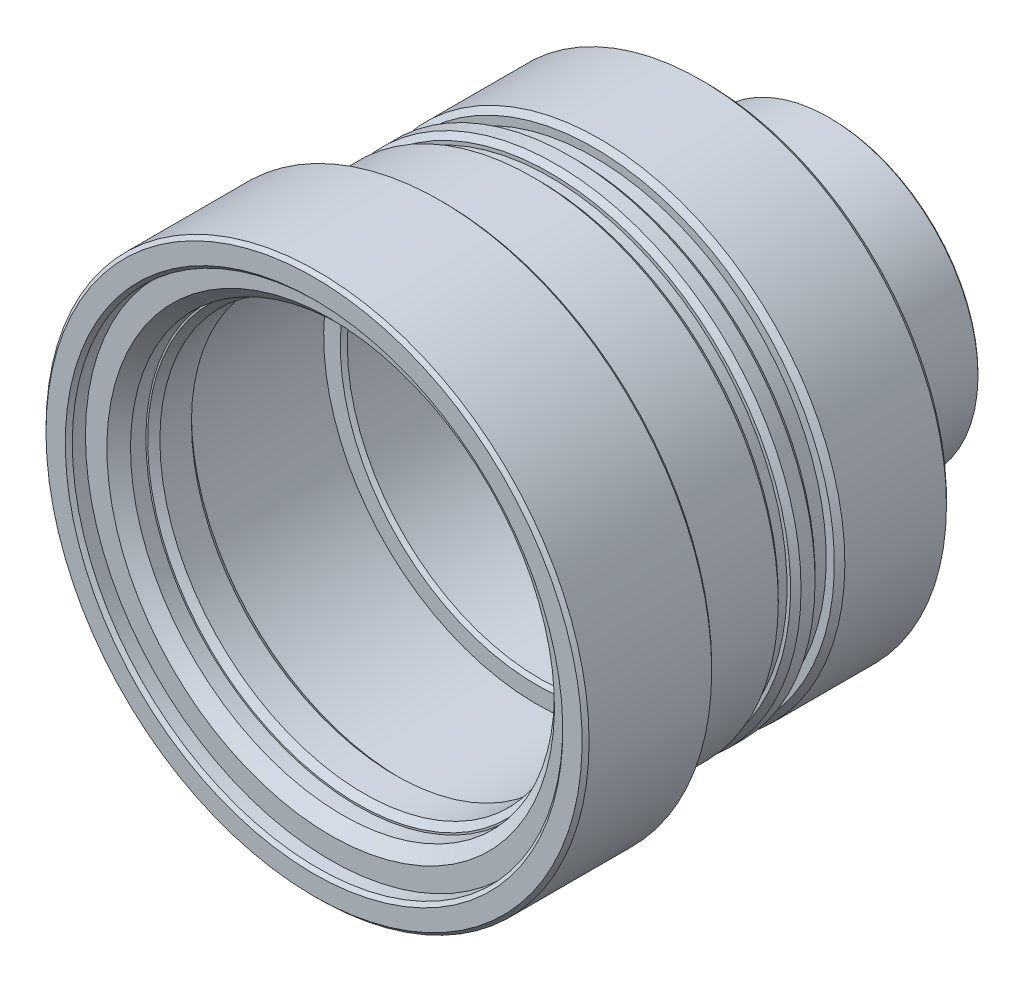
ISO-10303-21;
HEADER;
FILE_DESCRIPTION(('STEP AP214'),'2;1');
FILE_NAME('part.step','',(''),(''),'','','');
FILE_SCHEMA(('AUTOMOTIVE_DESIGN { 1 0 10303 214 1 1 1 1 }'));
ENDSEC;
DATA;
#1=APPLICATION_CONTEXT('core data for automotive mechanical design processes');
#2=APPLICATION_PROTOCOL_DEFINITION('international standard','automotive_design',2000,#1);
#3=PRODUCT_CONTEXT('',#1,'mechanical');
#4=PRODUCT('Part','Part','',(#3));
#5=PRODUCT_RELATED_PRODUCT_CATEGORY('part','',(#4));
#6=PRODUCT_DEFINITION_FORMATION('','',#4);
#7=PRODUCT_DEFINITION_CONTEXT('part definition',#1,'design');
#8=PRODUCT_DEFINITION('design','',#6,#7);
#9=PRODUCT_DEFINITION_SHAPE('','',#8);
#10=(LENGTH_UNIT() NAMED_UNIT(*) SI_UNIT(.MILLI.,.METRE.));
#11=(NAMED_UNIT(*) PLANE_ANGLE_UNIT() SI_UNIT($,.RADIAN.));
#12=(NAMED_UNIT(*) SI_UNIT($,.STERADIAN.) SOLID_ANGLE_UNIT());
#13=UNCERTAINTY_MEASURE_WITH_UNIT(LENGTH_MEASURE(1.E-05),#10,'distance_accuracy_value','');
#14=(GEOMETRIC_REPRESENTATION_CONTEXT(3) GLOBAL_UNCERTAINTY_ASSIGNED_CONTEXT((#13)) GLOBAL_UNIT_ASSIGNED_CONTEXT((#10,
#11,#12)) REPRESENTATION_CONTEXT('',''));
#15=CARTESIAN_POINT('',(0.,0.,0.));
#16=DIRECTION('',(0.,0.,1.));
#17=DIRECTION('',(1.,0.,0.));
#18=AXIS2_PLACEMENT_3D('',#15,#16,#17);
#19=CARTESIAN_POINT('',(0.,0.,18.716));
#20=DIRECTION('',(0.,0.,-1.));
#21=DIRECTION('',(-0.487500105082695,-0.873122928083074,0.));
#22=AXIS2_PLACEMENT_3D('',#19,#20,#21);
#23=PLANE('',#22);
#24=CARTESIAN_POINT('',(0.,0.,18.716));
#25=DIRECTION('',(0.,0.,1.));
#26=DIRECTION('',(0.873122928083074,-0.487500105082695,0.));
#27=AXIS2_PLACEMENT_3D('',#24,#25,#26);
#28=CIRCLE('',#27,12.);
#29=CARTESIAN_POINT('',(10.4774751369969,-5.85000126099234,18.716));
#30=VERTEX_POINT('',#29);
#31=EDGE_CURVE('E340',#30,#30,#28,.T.);
#32=ORIENTED_EDGE('',*,*,#31,.F.);
#33=EDGE_LOOP('',(#32));
#34=FACE_BOUND('',#33,.T.);
#35=CARTESIAN_POINT('',(0.,0.,18.716));
#36=DIRECTION('',(0.,0.,1.));
#37=DIRECTION('',(0.873122928083074,-0.487500105082695,0.));
#38=AXIS2_PLACEMENT_3D('',#35,#36,#37);
#39=CIRCLE('',#38,12.1);
#40=CARTESIAN_POINT('',(10.5647874298052,-5.89875127150061,18.716));
#41=VERTEX_POINT('',#40);
#42=EDGE_CURVE('E367',#41,#41,#39,.T.);
#43=ORIENTED_EDGE('',*,*,#42,.T.);
#44=EDGE_LOOP('',(#43));
#45=FACE_BOUND('',#44,.T.);
#46=ADVANCED_FACE('F16',(#34,#45),#23,.F.);
#47=CARTESIAN_POINT('',(0.,0.,20.266));
#48=DIRECTION('',(0.,0.,-1.));
#49=DIRECTION('',(-0.487500105082695,-0.873122928083074,0.));
#50=AXIS2_PLACEMENT_3D('',#47,#48,#49);
#51=PLANE('',#50);
#52=CARTESIAN_POINT('',(0.,0.,20.266));
#53=DIRECTION('',(0.,0.,1.));
#54=DIRECTION('',(0.873122928083074,-0.487500105082695,0.));
#55=AXIS2_PLACEMENT_3D('',#52,#53,#54);
#56=CIRCLE('',#55,12.774);
#57=CARTESIAN_POINT('',(11.1532722833332,-6.22732634232635,20.266));
#58=VERTEX_POINT('',#57);
#59=EDGE_CURVE('E139',#58,#58,#56,.T.);
#60=ORIENTED_EDGE('',*,*,#59,.F.);
#61=EDGE_LOOP('',(#60));
#62=FACE_BOUND('',#61,.T.);
#63=CARTESIAN_POINT('',(0.,0.,20.266));
#64=DIRECTION('',(0.,0.,1.));
#65=DIRECTION('',(0.873122928083074,-0.487500105082695,0.));
#66=AXIS2_PLACEMENT_3D('',#63,#64,#65);
#67=CIRCLE('',#66,14.);
#68=CARTESIAN_POINT('',(12.223720993163,-6.82500147115773,20.266));
#69=VERTEX_POINT('',#68);
#70=EDGE_CURVE('E150',#69,#69,#67,.T.);
#71=ORIENTED_EDGE('',*,*,#70,.T.);
#72=EDGE_LOOP('',(#71));
#73=FACE_BOUND('',#72,.T.);
#74=ADVANCED_FACE('F438',(#62,#73),#51,.F.);
#75=CARTESIAN_POINT('',(0.,0.,21.216));
#76=DIRECTION('',(0.,0.,-1.));
#77=DIRECTION('',(-0.487500105082695,-0.873122928083074,0.));
#78=AXIS2_PLACEMENT_3D('',#75,#76,#77);
#79=PLANE('',#78);
#80=CARTESIAN_POINT('',(0.,0.,21.216));
#81=DIRECTION('',(0.,0.,-1.));
#82=DIRECTION('',(-0.873122928083074,0.487500105082695,0.));
#83=AXIS2_PLACEMENT_3D('',#80,#81,#82);
#84=CIRCLE('',#83,14.2);
#85=CARTESIAN_POINT('',(12.3983455787797,-6.92250149217427,21.216));
#86=VERTEX_POINT('',#85);
#87=EDGE_CURVE('E292',#86,#86,#84,.T.);
#88=ORIENTED_EDGE('',*,*,#87,.T.);
#89=EDGE_LOOP('',(#88));
#90=FACE_BOUND('',#89,.T.);
#91=CARTESIAN_POINT('',(0.,0.,21.216));
#92=DIRECTION('',(0.,0.,1.));
#93=DIRECTION('',(-0.873122928083074,0.487500105082695,0.));
#94=AXIS2_PLACEMENT_3D('',#91,#92,#93);
#95=CIRCLE('',#94,15.3);
#96=CARTESIAN_POINT('',(-13.358780799671,7.45875160776524,21.216));
#97=VERTEX_POINT('',#96);
#98=EDGE_CURVE('E287',#97,#97,#95,.T.);
#99=ORIENTED_EDGE('',*,*,#98,.T.);
#100=EDGE_LOOP('',(#99));
#101=FACE_BOUND('',#100,.T.);
#102=ADVANCED_FACE('F444',(#90,#101),#79,.F.);
#103=CARTESIAN_POINT('',(0.,0.,13.816));
#104=DIRECTION('',(0.,0.,1.));
#105=DIRECTION('',(0.873122928083074,-0.487500105082695,0.));
#106=AXIS2_PLACEMENT_3D('',#103,#104,#105);
#107=PLANE('',#106);
#108=CARTESIAN_POINT('',(0.,0.,13.816));
#109=DIRECTION('',(0.,0.,1.));
#110=DIRECTION('',(0.873122928083074,-0.487500105082695,0.));
#111=AXIS2_PLACEMENT_3D('',#108,#109,#110);
#112=CIRCLE('',#111,13.7);
#113=CARTESIAN_POINT('',(11.9617841147381,-6.67875143963292,13.816));
#114=VERTEX_POINT('',#113);
#115=EDGE_CURVE('E266',#114,#114,#112,.T.);
#116=ORIENTED_EDGE('',*,*,#115,.T.);
#117=EDGE_LOOP('',(#116));
#118=FACE_BOUND('',#117,.T.);
#119=CARTESIAN_POINT('',(0.,0.,13.816));
#120=DIRECTION('',(0.,0.,-1.));
#121=DIRECTION('',(0.873122928083074,-0.487500105082695,0.));
#122=AXIS2_PLACEMENT_3D('',#119,#120,#121);
#123=CIRCLE('',#122,15.3);
#124=CARTESIAN_POINT('',(13.358780799671,-7.45875160776523,13.816));
#125=VERTEX_POINT('',#124);
#126=EDGE_CURVE('E400',#125,#125,#123,.T.);
#127=ORIENTED_EDGE('',*,*,#126,.T.);
#128=EDGE_LOOP('',(#127));
#129=FACE_BOUND('',#128,.T.);
#130=ADVANCED_FACE('F494',(#118,#129),#107,.F.);
#131=CARTESIAN_POINT('',(0.,0.,8.416));
#132=DIRECTION('',(0.,0.,1.));
#133=DIRECTION('',(0.873122928083074,-0.487500105082695,0.));
#134=AXIS2_PLACEMENT_3D('',#131,#132,#133);
#135=PLANE('',#134);
#136=CARTESIAN_POINT('',(0.,0.,8.416));
#137=DIRECTION('',(0.,0.,1.));
#138=DIRECTION('',(0.873122928083074,-0.487500105082695,0.));
#139=AXIS2_PLACEMENT_3D('',#136,#137,#138);
#140=CIRCLE('',#139,13.5);
#141=CARTESIAN_POINT('',(11.7871595291215,-6.58125141861638,8.416));
#142=VERTEX_POINT('',#141);
#143=EDGE_CURVE('E336',#142,#142,#140,.T.);
#144=ORIENTED_EDGE('',*,*,#143,.T.);
#145=EDGE_LOOP('',(#144));
#146=FACE_BOUND('',#145,.T.);
#147=CARTESIAN_POINT('',(0.,0.,8.416));
#148=DIRECTION('',(0.,0.,1.));
#149=DIRECTION('',(0.873122928083074,-0.487500105082695,0.));
#150=AXIS2_PLACEMENT_3D('',#147,#148,#149);
#151=CIRCLE('',#150,13.7);
#152=CARTESIAN_POINT('',(-11.9617841147381,6.67875143963293,8.416));
#153=VERTEX_POINT('',#152);
#154=EDGE_CURVE('E256',#153,#153,#151,.T.);
#155=ORIENTED_EDGE('',*,*,#154,.F.);
#156=EDGE_LOOP('',(#155));
#157=FACE_BOUND('',#156,.T.);
#158=ADVANCED_FACE('F497',(#146,#157),#135,.F.);
#159=CARTESIAN_POINT('',(0.,0.,7.716));
#160=DIRECTION('',(0.,0.,-1.));
#161=DIRECTION('',(-0.487500105082695,-0.873122928083074,0.));
#162=AXIS2_PLACEMENT_3D('',#159,#160,#161);
#163=PLANE('',#162);
#164=CARTESIAN_POINT('',(0.,0.,7.716));
#165=DIRECTION('',(0.,0.,1.));
#166=DIRECTION('',(0.873122928083074,-0.487500105082695,0.));
#167=AXIS2_PLACEMENT_3D('',#164,#165,#166);
#168=CIRCLE('',#167,13.5);
#169=CARTESIAN_POINT('',(-11.7871595291215,6.58125141861639,7.716));
#170=VERTEX_POINT('',#169);
#171=EDGE_CURVE('E263',#170,#170,#168,.T.);
#172=ORIENTED_EDGE('',*,*,#171,.F.);
#173=EDGE_LOOP('',(#172));
#174=FACE_BOUND('',#173,.T.);
#175=CARTESIAN_POINT('',(0.,0.,7.716));
#176=DIRECTION('',(0.,0.,1.));
#177=DIRECTION('',(0.873122928083074,-0.487500105082695,0.));
#178=AXIS2_PLACEMENT_3D('',#175,#176,#177);
#179=CIRCLE('',#178,13.7);
#180=CARTESIAN_POINT('',(-11.9617841147381,6.67875143963293,7.716));
#181=VERTEX_POINT('',#180);
#182=EDGE_CURVE('E269',#181,#181,#179,.T.);
#183=ORIENTED_EDGE('',*,*,#182,.T.);
#184=EDGE_LOOP('',(#183));
#185=FACE_BOUND('',#184,.T.);
#186=ADVANCED_FACE('F544',(#174,#185),#163,.F.);
#187=CARTESIAN_POINT('',(0.,0.,6.316));
#188=DIRECTION('',(0.,0.,1.));
#189=DIRECTION('',(0.873122928083074,-0.487500105082695,0.));
#190=AXIS2_PLACEMENT_3D('',#187,#188,#189);
#191=PLANE('',#190);
#192=CARTESIAN_POINT('',(0.,0.,6.316));
#193=DIRECTION('',(0.,0.,1.));
#194=DIRECTION('',(0.873122928083074,-0.487500105082695,0.));
#195=AXIS2_PLACEMENT_3D('',#192,#193,#194);
#196=CIRCLE('',#195,13.235);
#197=CARTESIAN_POINT('',(11.5557819531795,-6.45206389076947,6.316));
#198=VERTEX_POINT('',#197);
#199=EDGE_CURVE('E328',#198,#198,#196,.T.);
#200=ORIENTED_EDGE('',*,*,#199,.T.);
#201=EDGE_LOOP('',(#200));
#202=FACE_BOUND('',#201,.T.);
#203=CARTESIAN_POINT('',(0.,0.,6.316));
#204=DIRECTION('',(0.,0.,1.));
#205=DIRECTION('',(0.873122928083074,-0.487500105082695,0.));
#206=AXIS2_PLACEMENT_3D('',#203,#204,#205);
#207=CIRCLE('',#206,13.7);
#208=CARTESIAN_POINT('',(-11.9617841147381,6.67875143963293,6.316));
#209=VERTEX_POINT('',#208);
#210=EDGE_CURVE('E403',#209,#209,#207,.T.);
#211=ORIENTED_EDGE('',*,*,#210,.F.);
#212=EDGE_LOOP('',(#211));
#213=FACE_BOUND('',#212,.T.);
#214=ADVANCED_FACE('F18',(#202,#213),#191,.F.);
#215=CARTESIAN_POINT('',(0.,0.,5.216));
#216=DIRECTION('',(0.,0.,-1.));
#217=DIRECTION('',(-0.487500105082695,-0.873122928083074,0.));
#218=AXIS2_PLACEMENT_3D('',#215,#216,#217);
#219=PLANE('',#218);
#220=CARTESIAN_POINT('',(0.,0.,5.216));
#221=DIRECTION('',(0.,0.,1.));
#222=DIRECTION('',(0.873122928083074,-0.487500105082695,0.));
#223=AXIS2_PLACEMENT_3D('',#220,#221,#222);
#224=CIRCLE('',#223,13.235);
#225=CARTESIAN_POINT('',(-11.5557819531795,6.45206389076947,5.216));
#226=VERTEX_POINT('',#225);
#227=EDGE_CURVE('E406',#226,#226,#224,.T.);
#228=ORIENTED_EDGE('',*,*,#227,.F.);
#229=EDGE_LOOP('',(#228));
#230=FACE_BOUND('',#229,.T.);
#231=CARTESIAN_POINT('',(0.,0.,5.216));
#232=DIRECTION('',(0.,0.,1.));
#233=DIRECTION('',(0.873122928083074,-0.487500105082695,0.));
#234=AXIS2_PLACEMENT_3D('',#231,#232,#233);
#235=CIRCLE('',#234,13.7);
#236=CARTESIAN_POINT('',(-11.9617841147381,6.67875143963293,5.216));
#237=VERTEX_POINT('',#236);
#238=EDGE_CURVE('E324',#237,#237,#235,.T.);
#239=ORIENTED_EDGE('',*,*,#238,.T.);
#240=EDGE_LOOP('',(#239));
#241=FACE_BOUND('',#240,.T.);
#242=ADVANCED_FACE('F422',(#230,#241),#219,.F.);
#243=CARTESIAN_POINT('',(0.,0.,-1.184));
#244=DIRECTION('',(0.,0.,1.));
#245=DIRECTION('',(0.873122928083074,-0.487500105082695,0.));
#246=AXIS2_PLACEMENT_3D('',#243,#244,#245);
#247=PLANE('',#246);
#248=CARTESIAN_POINT('',(0.,0.,-1.184));
#249=DIRECTION('',(0.,0.,1.));
#250=DIRECTION('',(0.873122928083074,-0.487500105082695,0.));
#251=AXIS2_PLACEMENT_3D('',#248,#249,#250);
#252=CIRCLE('',#251,8.5);
#253=CARTESIAN_POINT('',(7.42154488870613,-4.14375089320291,-1.184));
#254=VERTEX_POINT('',#253);
#255=EDGE_CURVE('E329',#254,#254,#252,.T.);
#256=ORIENTED_EDGE('',*,*,#255,.T.);
#257=EDGE_LOOP('',(#256));
#258=FACE_BOUND('',#257,.T.);
#259=CARTESIAN_POINT('',(0.,0.,-1.184));
#260=DIRECTION('',(0.,0.,1.));
#261=DIRECTION('',(0.873122928083074,-0.487500105082695,0.));
#262=AXIS2_PLACEMENT_3D('',#259,#260,#261);
#263=CIRCLE('',#262,13.7);
#264=CARTESIAN_POINT('',(-11.9617841147381,6.67875143963293,-1.184));
#265=VERTEX_POINT('',#264);
#266=EDGE_CURVE('E333',#265,#265,#263,.T.);
#267=ORIENTED_EDGE('',*,*,#266,.F.);
#268=EDGE_LOOP('',(#267));
#269=FACE_BOUND('',#268,.T.);
#270=ADVANCED_FACE('F419',(#258,#269),#247,.F.);
#271=CARTESIAN_POINT('',(0.,0.,-8.284));
#272=DIRECTION('',(0.,0.,1.));
#273=DIRECTION('',(0.873122928083074,-0.487500105082695,0.));
#274=AXIS2_PLACEMENT_3D('',#271,#272,#273);
#275=PLANE('',#274);
#276=CARTESIAN_POINT('',(0.,0.,-8.284));
#277=DIRECTION('',(0.,0.,1.));
#278=DIRECTION('',(0.873122928083074,-0.487500105082695,0.));
#279=AXIS2_PLACEMENT_3D('',#276,#277,#278);
#280=CIRCLE('',#279,7.5);
#281=CARTESIAN_POINT('',(-6.54842196062306,3.65625078812022,-8.284));
#282=VERTEX_POINT('',#281);
#283=EDGE_CURVE('E274',#282,#282,#280,.T.);
#284=ORIENTED_EDGE('',*,*,#283,.T.);
#285=EDGE_LOOP('',(#284));
#286=FACE_BOUND('',#285,.T.);
#287=CARTESIAN_POINT('',(0.,0.,-8.284));
#288=DIRECTION('',(0.,0.,-1.));
#289=DIRECTION('',(0.873122928083074,-0.487500105082695,0.));
#290=AXIS2_PLACEMENT_3D('',#287,#288,#289);
#291=CIRCLE('',#290,8.4);
#292=CARTESIAN_POINT('',(7.33423259589782,-4.09500088269464,-8.284));
#293=VERTEX_POINT('',#292);
#294=EDGE_CURVE('E315',#293,#293,#291,.T.);
#295=ORIENTED_EDGE('',*,*,#294,.T.);
#296=EDGE_LOOP('',(#295));
#297=FACE_BOUND('',#296,.T.);
#298=ADVANCED_FACE('F421',(#286,#297),#275,.F.);
#299=CARTESIAN_POINT('',(0.,0.,-4.784));
#300=DIRECTION('',(0.,0.,-1.));
#301=DIRECTION('',(-0.487500105082695,-0.873122928083074,0.));
#302=AXIS2_PLACEMENT_3D('',#299,#300,#301);
#303=PLANE('',#302);
#304=CARTESIAN_POINT('',(0.,0.,-4.784));
#305=DIRECTION('',(0.,0.,1.));
#306=DIRECTION('',(0.873122928083074,-0.487500105082695,0.));
#307=AXIS2_PLACEMENT_3D('',#304,#305,#306);
#308=CIRCLE('',#307,7.5);
#309=CARTESIAN_POINT('',(6.54842196062306,-3.65625078812021,-4.784));
#310=VERTEX_POINT('',#309);
#311=EDGE_CURVE('E273',#310,#310,#308,.T.);
#312=ORIENTED_EDGE('',*,*,#311,.F.);
#313=EDGE_LOOP('',(#312));
#314=FACE_BOUND('',#313,.T.);
#315=CARTESIAN_POINT('',(0.,0.,-4.784));
#316=DIRECTION('',(0.,0.,1.));
#317=DIRECTION('',(0.873122928083074,-0.487500105082695,0.));
#318=AXIS2_PLACEMENT_3D('',#315,#316,#317);
#319=CIRCLE('',#318,7.7);
#320=CARTESIAN_POINT('',(6.72304654623967,-3.75375080913675,-4.784));
#321=VERTEX_POINT('',#320);
#322=EDGE_CURVE('E355',#321,#321,#319,.T.);
#323=ORIENTED_EDGE('',*,*,#322,.T.);
#324=EDGE_LOOP('',(#323));
#325=FACE_BOUND('',#324,.T.);
#326=ADVANCED_FACE('F430',(#314,#325),#303,.F.);
#327=CARTESIAN_POINT('',(0.,0.,-4.284));
#328=DIRECTION('',(0.,0.,1.));
#329=DIRECTION('',(0.873122928083074,-0.487500105082695,0.));
#330=AXIS2_PLACEMENT_3D('',#327,#328,#329);
#331=PLANE('',#330);
#332=CARTESIAN_POINT('',(0.,0.,-4.284));
#333=DIRECTION('',(0.,0.,1.));
#334=DIRECTION('',(0.873122928083074,-0.487500105082695,0.));
#335=AXIS2_PLACEMENT_3D('',#332,#333,#334);
#336=CIRCLE('',#335,7.2);
#337=CARTESIAN_POINT('',(-6.28648508219814,3.51000075659541,-4.284));
#338=VERTEX_POINT('',#337);
#339=EDGE_CURVE('E293',#338,#338,#336,.T.);
#340=ORIENTED_EDGE('',*,*,#339,.T.);
#341=EDGE_LOOP('',(#340));
#342=FACE_BOUND('',#341,.T.);
#343=CARTESIAN_POINT('',(0.,0.,-4.284));
#344=DIRECTION('',(0.,0.,1.));
#345=DIRECTION('',(0.873122928083074,-0.487500105082695,0.));
#346=AXIS2_PLACEMENT_3D('',#343,#344,#345);
#347=CIRCLE('',#346,7.7);
#348=CARTESIAN_POINT('',(6.72304654623967,-3.75375080913675,-4.284));
#349=VERTEX_POINT('',#348);
#350=EDGE_CURVE('E346',#349,#349,#347,.T.);
#351=ORIENTED_EDGE('',*,*,#350,.F.);
#352=EDGE_LOOP('',(#351));
#353=FACE_BOUND('',#352,.T.);
#354=ADVANCED_FACE('F646',(#342,#353),#331,.F.);
#355=CARTESIAN_POINT('',(0.,0.,1.216));
#356=DIRECTION('',(0.,0.,1.));
#357=DIRECTION('',(0.873122928083074,-0.487500105082695,0.));
#358=AXIS2_PLACEMENT_3D('',#355,#356,#357);
#359=PLANE('',#358);
#360=CARTESIAN_POINT('',(0.,0.,1.216));
#361=DIRECTION('',(0.,0.,1.));
#362=DIRECTION('',(0.873122928083074,-0.487500105082695,0.));
#363=AXIS2_PLACEMENT_3D('',#360,#361,#362);
#364=CIRCLE('',#363,2.85);
#365=CARTESIAN_POINT('',(-2.48840034503677,1.38937529948568,1.216));
#366=VERTEX_POINT('',#365);
#367=EDGE_CURVE('E352',#366,#366,#364,.T.);
#368=ORIENTED_EDGE('',*,*,#367,.T.);
#369=EDGE_LOOP('',(#368));
#370=FACE_BOUND('',#369,.T.);
#371=CARTESIAN_POINT('',(0.,0.,1.216));
#372=DIRECTION('',(0.,0.,1.));
#373=DIRECTION('',(0.873122928083074,-0.487500105082695,0.));
#374=AXIS2_PLACEMENT_3D('',#371,#372,#373);
#375=CIRCLE('',#374,7.);
#376=CARTESIAN_POINT('',(6.11186049658152,-3.41250073557887,1.216));
#377=VERTEX_POINT('',#376);
#378=EDGE_CURVE('E343',#377,#377,#375,.T.);
#379=ORIENTED_EDGE('',*,*,#378,.F.);
#380=EDGE_LOOP('',(#379));
#381=FACE_BOUND('',#380,.T.);
#382=ADVANCED_FACE('F651',(#370,#381),#359,.F.);
#383=CARTESIAN_POINT('',(0.,0.,2.216));
#384=DIRECTION('',(0.,0.,-1.));
#385=DIRECTION('',(-0.487500105082695,-0.873122928083074,0.));
#386=AXIS2_PLACEMENT_3D('',#383,#384,#385);
#387=PLANE('',#386);
#388=CARTESIAN_POINT('',(0.,0.,2.216));
#389=DIRECTION('',(0.,0.,-1.));
#390=DIRECTION('',(-0.873122928083074,0.487500105082695,0.));
#391=AXIS2_PLACEMENT_3D('',#388,#389,#390);
#392=CIRCLE('',#391,2.2);
#393=CARTESIAN_POINT('',(1.92087044178276,-1.07250023118193,2.216));
#394=VERTEX_POINT('',#393);
#395=EDGE_CURVE('E289',#394,#394,#392,.T.);
#396=ORIENTED_EDGE('',*,*,#395,.T.);
#397=EDGE_LOOP('',(#396));
#398=FACE_BOUND('',#397,.T.);
#399=CARTESIAN_POINT('',(0.,0.,2.216));
#400=DIRECTION('',(0.,0.,1.));
#401=DIRECTION('',(0.873122928083074,-0.487500105082695,0.));
#402=AXIS2_PLACEMENT_3D('',#399,#400,#401);
#403=CIRCLE('',#402,10.7145);
#404=CARTESIAN_POINT('',(-9.3550756129461,5.22331987590854,2.216));
#405=VERTEX_POINT('',#404);
#406=EDGE_CURVE('E386',#405,#405,#403,.T.);
#407=ORIENTED_EDGE('',*,*,#406,.T.);
#408=EDGE_LOOP('',(#407));
#409=FACE_BOUND('',#408,.T.);
#410=ADVANCED_FACE('F450',(#398,#409),#387,.F.);
#411=CARTESIAN_POINT('',(0.,0.,8.51609074784113));
#412=DIRECTION('',(0.,0.,-1.));
#413=DIRECTION('',(-0.487500105082695,-0.873122928083074,0.));
#414=AXIS2_PLACEMENT_3D('',#411,#412,#413);
#415=PLANE('',#414);
#416=CARTESIAN_POINT('',(0.,0.,8.51609074784113));
#417=DIRECTION('',(0.,0.,-1.));
#418=DIRECTION('',(-0.873122928083074,0.487500105082695,0.));
#419=AXIS2_PLACEMENT_3D('',#416,#417,#418);
#420=CIRCLE('',#419,11.2);
#421=CARTESIAN_POINT('',(9.77897679453042,-5.46000117692618,8.51609074784113));
#422=VERTEX_POINT('',#421);
#423=EDGE_CURVE('E310',#422,#422,#420,.T.);
#424=ORIENTED_EDGE('',*,*,#423,.T.);
#425=EDGE_LOOP('',(#424));
#426=FACE_BOUND('',#425,.T.);
#427=CARTESIAN_POINT('',(0.,0.,8.51609074784113));
#428=DIRECTION('',(0.,0.,1.));
#429=DIRECTION('',(0.873122928083074,-0.487500105082695,0.));
#430=AXIS2_PLACEMENT_3D('',#427,#428,#429);
#431=CIRCLE('',#430,12.15);
#432=CARTESIAN_POINT('',(10.6084435762093,-5.92312627675475,8.51609074784113));
#433=VERTEX_POINT('',#432);
#434=EDGE_CURVE('E317',#433,#433,#431,.T.);
#435=ORIENTED_EDGE('',*,*,#434,.T.);
#436=EDGE_LOOP('',(#435));
#437=FACE_BOUND('',#436,.T.);
#438=ADVANCED_FACE('F461',(#426,#437),#415,.F.);
#439=CARTESIAN_POINT('',(0.,0.,16.216));
#440=DIRECTION('',(0.,0.,1.));
#441=DIRECTION('',(0.873122928083074,-0.487500105082695,0.));
#442=AXIS2_PLACEMENT_3D('',#439,#440,#441);
#443=PLANE('',#442);
#444=CARTESIAN_POINT('',(0.,0.,16.216));
#445=DIRECTION('',(0.,0.,1.));
#446=DIRECTION('',(0.873122928083074,-0.487500105082695,0.));
#447=AXIS2_PLACEMENT_3D('',#444,#445,#446);
#448=CIRCLE('',#447,12.);
#449=CARTESIAN_POINT('',(-10.4774751369969,5.85000126099234,16.216));
#450=VERTEX_POINT('',#449);
#451=EDGE_CURVE('E11',#450,#450,#448,.T.);
#452=ORIENTED_EDGE('',*,*,#451,.T.);
#453=EDGE_LOOP('',(#452));
#454=FACE_BOUND('',#453,.T.);
#455=CARTESIAN_POINT('',(0.,0.,16.216));
#456=DIRECTION('',(0.,0.,1.));
#457=DIRECTION('',(0.873122928083074,-0.487500105082695,0.));
#458=AXIS2_PLACEMENT_3D('',#455,#456,#457);
#459=CIRCLE('',#458,12.15);
#460=CARTESIAN_POINT('',(10.6084435762093,-5.92312627675475,16.216));
#461=VERTEX_POINT('',#460);
#462=EDGE_CURVE('E320',#461,#461,#459,.T.);
#463=ORIENTED_EDGE('',*,*,#462,.F.);
#464=EDGE_LOOP('',(#463));
#465=FACE_BOUND('',#464,.T.);
#466=ADVANCED_FACE('F458',(#454,#465),#443,.F.);
#467=CARTESIAN_POINT('',(0.,0.,23.8830623145401));
#468=DIRECTION('',(0.,0.,1.));
#469=DIRECTION('',(0.873122928083074,-0.487500105082695,0.));
#470=AXIS2_PLACEMENT_3D('',#467,#468,#469);
#471=CYLINDRICAL_SURFACE('',#470,11.65);
#472=CARTESIAN_POINT('',(0.,0.,18.366));
#473=DIRECTION('',(0.,0.,1.));
#474=DIRECTION('',(0.873122928083074,-0.487500105082695,0.));
#475=AXIS2_PLACEMENT_3D('',#472,#473,#474);
#476=CIRCLE('',#475,11.65);
#477=CARTESIAN_POINT('',(10.1718821121678,-5.6793762242134,18.366));
#478=VERTEX_POINT('',#477);
#479=EDGE_CURVE('E337',#478,#478,#476,.T.);
#480=ORIENTED_EDGE('',*,*,#479,.T.);
#481=EDGE_LOOP('',(#480));
#482=FACE_BOUND('',#481,.T.);
#483=CARTESIAN_POINT('',(0.,0.,16.566));
#484=DIRECTION('',(0.,0.,1.));
#485=DIRECTION('',(0.873122928083074,-0.487500105082695,0.));
#486=AXIS2_PLACEMENT_3D('',#483,#484,#485);
#487=CIRCLE('',#486,11.65);
#488=CARTESIAN_POINT('',(10.1718821121678,-5.6793762242134,16.566));
#489=VERTEX_POINT('',#488);
#490=EDGE_CURVE('E27',#489,#489,#487,.T.);
#491=ORIENTED_EDGE('',*,*,#490,.F.);
#492=EDGE_LOOP('',(#491));
#493=FACE_BOUND('',#492,.T.);
#494=ADVANCED_FACE('F460',(#482,#493),#471,.F.);
#495=CARTESIAN_POINT('',(0.,0.,16.566));
#496=DIRECTION('',(0.,0.,-1.));
#497=DIRECTION('',(-0.873122928083074,0.487500105082695,0.));
#498=AXIS2_PLACEMENT_3D('',#495,#496,#497);
#499=CONICAL_SURFACE('',#498,11.65,0.78539816339745);
#500=ORIENTED_EDGE('',*,*,#451,.F.);
#501=EDGE_LOOP('',(#500));
#502=FACE_BOUND('',#501,.T.);
#503=ORIENTED_EDGE('',*,*,#490,.T.);
#504=EDGE_LOOP('',(#503));
#505=FACE_BOUND('',#504,.T.);
#506=ADVANCED_FACE('F548',(#502,#505),#499,.F.);
#507=CARTESIAN_POINT('',(0.,0.,23.8830623145401));
#508=DIRECTION('',(0.,0.,1.));
#509=DIRECTION('',(0.873122928083074,-0.487500105082695,0.));
#510=AXIS2_PLACEMENT_3D('',#507,#508,#509);
#511=CYLINDRICAL_SURFACE('',#510,12.15);
#512=ORIENTED_EDGE('',*,*,#462,.T.);
#513=EDGE_LOOP('',(#512));
#514=FACE_BOUND('',#513,.T.);
#515=ORIENTED_EDGE('',*,*,#434,.F.);
#516=EDGE_LOOP('',(#515));
#517=FACE_BOUND('',#516,.T.);
#518=ADVANCED_FACE('F506',(#514,#517),#511,.F.);
#519=CARTESIAN_POINT('',(0.,0.,23.8830623145401));
#520=DIRECTION('',(0.,0.,1.));
#521=DIRECTION('',(0.873122928083074,-0.487500105082695,0.));
#522=AXIS2_PLACEMENT_3D('',#519,#520,#521);
#523=CYLINDRICAL_SURFACE('',#522,11.);
#524=CARTESIAN_POINT('',(0.,0.,8.31609074784114));
#525=DIRECTION('',(0.,0.,1.));
#526=DIRECTION('',(-0.873122928083074,0.487500105082695,0.));
#527=AXIS2_PLACEMENT_3D('',#524,#525,#526);
#528=CIRCLE('',#527,11.);
#529=CARTESIAN_POINT('',(9.60435220891381,-5.36250115590965,8.31609074784114));
#530=VERTEX_POINT('',#529);
#531=EDGE_CURVE('E376',#530,#530,#528,.T.);
#532=ORIENTED_EDGE('',*,*,#531,.T.);
#533=EDGE_LOOP('',(#532));
#534=FACE_BOUND('',#533,.T.);
#535=CARTESIAN_POINT('',(0.,0.,2.01609074784113));
#536=DIRECTION('',(0.,0.,1.));
#537=DIRECTION('',(0.873122928083074,-0.487500105082695,0.));
#538=AXIS2_PLACEMENT_3D('',#535,#536,#537);
#539=CIRCLE('',#538,11.);
#540=CARTESIAN_POINT('',(-9.60435220891382,5.36250115590965,2.01609074784113));
#541=VERTEX_POINT('',#540);
#542=EDGE_CURVE('E321',#541,#541,#539,.T.);
#543=ORIENTED_EDGE('',*,*,#542,.F.);
#544=EDGE_LOOP('',(#543));
#545=FACE_BOUND('',#544,.T.);
#546=ADVANCED_FACE('F503',(#534,#545),#523,.F.);
#547=CARTESIAN_POINT('',(0.,0.,2.216));
#548=DIRECTION('',(0.,0.,-1.));
#549=DIRECTION('',(-0.873122928083074,0.487500105082695,0.));
#550=AXIS2_PLACEMENT_3D('',#547,#548,#549);
#551=CONICAL_SURFACE('',#550,10.7145,0.959931088596881);
#552=ORIENTED_EDGE('',*,*,#542,.T.);
#553=EDGE_LOOP('',(#552));
#554=FACE_BOUND('',#553,.T.);
#555=ORIENTED_EDGE('',*,*,#406,.F.);
#556=EDGE_LOOP('',(#555));
#557=FACE_BOUND('',#556,.T.);
#558=ADVANCED_FACE('F471',(#554,#557),#551,.T.);
#559=CARTESIAN_POINT('',(0.,0.,23.8830623145401));
#560=DIRECTION('',(0.,0.,1.));
#561=DIRECTION('',(0.873122928083074,-0.487500105082695,0.));
#562=AXIS2_PLACEMENT_3D('',#559,#560,#561);
#563=CYLINDRICAL_SURFACE('',#562,2.1);
#564=CARTESIAN_POINT('',(0.,0.,2.116));
#565=DIRECTION('',(0.,0.,1.));
#566=DIRECTION('',(-0.873122928083074,0.487500105082695,0.));
#567=AXIS2_PLACEMENT_3D('',#564,#565,#566);
#568=CIRCLE('',#567,2.1);
#569=CARTESIAN_POINT('',(1.83355814897445,-1.02375022067366,2.116));
#570=VERTEX_POINT('',#569);
#571=EDGE_CURVE('E286',#570,#570,#568,.T.);
#572=ORIENTED_EDGE('',*,*,#571,.T.);
#573=EDGE_LOOP('',(#572));
#574=FACE_BOUND('',#573,.T.);
#575=CARTESIAN_POINT('',(0.,0.,1.966));
#576=DIRECTION('',(0.,0.,1.));
#577=DIRECTION('',(0.873122928083074,-0.487500105082695,0.));
#578=AXIS2_PLACEMENT_3D('',#575,#576,#577);
#579=CIRCLE('',#578,2.1);
#580=CARTESIAN_POINT('',(1.83355814897445,-1.02375022067366,1.966));
#581=VERTEX_POINT('',#580);
#582=EDGE_CURVE('E345',#581,#581,#579,.T.);
#583=ORIENTED_EDGE('',*,*,#582,.F.);
#584=EDGE_LOOP('',(#583));
#585=FACE_BOUND('',#584,.T.);
#586=ADVANCED_FACE('F467',(#574,#585),#563,.F.);
#587=CARTESIAN_POINT('',(0.,0.,1.966));
#588=DIRECTION('',(0.,0.,-1.));
#589=DIRECTION('',(-0.873122928083074,0.487500105082695,0.));
#590=AXIS2_PLACEMENT_3D('',#587,#588,#589);
#591=CONICAL_SURFACE('',#590,2.1,0.78539816339745);
#592=ORIENTED_EDGE('',*,*,#367,.F.);
#593=EDGE_LOOP('',(#592));
#594=FACE_BOUND('',#593,.T.);
#595=ORIENTED_EDGE('',*,*,#582,.T.);
#596=EDGE_LOOP('',(#595));
#597=FACE_BOUND('',#596,.T.);
#598=ADVANCED_FACE('F463',(#594,#597),#591,.F.);
#599=CARTESIAN_POINT('',(0.,0.,23.8830623145401));
#600=DIRECTION('',(0.,0.,1.));
#601=DIRECTION('',(0.873122928083074,-0.487500105082695,0.));
#602=AXIS2_PLACEMENT_3D('',#599,#600,#601);
#603=CYLINDRICAL_SURFACE('',#602,7.);
#604=ORIENTED_EDGE('',*,*,#378,.T.);
#605=EDGE_LOOP('',(#604));
#606=FACE_BOUND('',#605,.T.);
#607=CARTESIAN_POINT('',(0.,0.,-4.084));
#608=DIRECTION('',(0.,0.,-1.));
#609=DIRECTION('',(0.873122928083074,-0.487500105082695,0.));
#610=AXIS2_PLACEMENT_3D('',#607,#608,#609);
#611=CIRCLE('',#610,7.);
#612=CARTESIAN_POINT('',(-6.11186049658152,3.41250073557887,-4.084));
#613=VERTEX_POINT('',#612);
#614=EDGE_CURVE('E301',#613,#613,#611,.T.);
#615=ORIENTED_EDGE('',*,*,#614,.T.);
#616=EDGE_LOOP('',(#615));
#617=FACE_BOUND('',#616,.T.);
#618=ADVANCED_FACE('F466',(#606,#617),#603,.F.);
#619=CARTESIAN_POINT('',(0.,0.,23.8830623145401));
#620=DIRECTION('',(0.,0.,1.));
#621=DIRECTION('',(0.873122928083074,-0.487500105082695,0.));
#622=AXIS2_PLACEMENT_3D('',#619,#620,#621);
#623=CYLINDRICAL_SURFACE('',#622,7.7);
#624=ORIENTED_EDGE('',*,*,#350,.T.);
#625=EDGE_LOOP('',(#624));
#626=FACE_BOUND('',#625,.T.);
#627=ORIENTED_EDGE('',*,*,#322,.F.);
#628=EDGE_LOOP('',(#627));
#629=FACE_BOUND('',#628,.T.);
#630=ADVANCED_FACE('F516',(#626,#629),#623,.F.);
#631=CARTESIAN_POINT('',(0.,0.,-4.784));
#632=DIRECTION('',(0.,0.,1.));
#633=DIRECTION('',(0.873122928083074,-0.487500105082695,0.));
#634=AXIS2_PLACEMENT_3D('',#631,#632,#633);
#635=CONICAL_SURFACE('',#634,7.5,0.785398163397448);
#636=ORIENTED_EDGE('',*,*,#311,.T.);
#637=EDGE_LOOP('',(#636));
#638=FACE_BOUND('',#637,.T.);
#639=CARTESIAN_POINT('',(0.,0.,-5.084));
#640=DIRECTION('',(0.,0.,1.));
#641=DIRECTION('',(0.873122928083074,-0.487500105082695,0.));
#642=AXIS2_PLACEMENT_3D('',#639,#640,#641);
#643=CIRCLE('',#642,7.2);
#644=CARTESIAN_POINT('',(6.28648508219813,-3.51000075659541,-5.084));
#645=VERTEX_POINT('',#644);
#646=EDGE_CURVE('E271',#645,#645,#643,.T.);
#647=ORIENTED_EDGE('',*,*,#646,.F.);
#648=EDGE_LOOP('',(#647));
#649=FACE_BOUND('',#648,.T.);
#650=ADVANCED_FACE('F477',(#638,#649),#635,.F.);
#651=CARTESIAN_POINT('',(0.,0.,23.8830623145401));
#652=DIRECTION('',(0.,0.,1.));
#653=DIRECTION('',(0.873122928083074,-0.487500105082695,0.));
#654=AXIS2_PLACEMENT_3D('',#651,#652,#653);
#655=CYLINDRICAL_SURFACE('',#654,7.2);
#656=ORIENTED_EDGE('',*,*,#646,.T.);
#657=EDGE_LOOP('',(#656));
#658=FACE_BOUND('',#657,.T.);
#659=CARTESIAN_POINT('',(0.,0.,-7.984));
#660=DIRECTION('',(0.,0.,1.));
#661=DIRECTION('',(0.873122928083074,-0.487500105082695,0.));
#662=AXIS2_PLACEMENT_3D('',#659,#660,#661);
#663=CIRCLE('',#662,7.2);
#664=CARTESIAN_POINT('',(6.28648508219813,-3.51000075659541,-7.984));
#665=VERTEX_POINT('',#664);
#666=EDGE_CURVE('E332',#665,#665,#663,.T.);
#667=ORIENTED_EDGE('',*,*,#666,.F.);
#668=EDGE_LOOP('',(#667));
#669=FACE_BOUND('',#668,.T.);
#670=ADVANCED_FACE('F473',(#658,#669),#655,.F.);
#671=CARTESIAN_POINT('',(0.,0.,-7.984));
#672=DIRECTION('',(0.,0.,-1.));
#673=DIRECTION('',(-0.873122928083074,0.487500105082695,0.));
#674=AXIS2_PLACEMENT_3D('',#671,#672,#673);
#675=CONICAL_SURFACE('',#674,7.2,0.785398163397457);
#676=ORIENTED_EDGE('',*,*,#283,.F.);
#677=EDGE_LOOP('',(#676));
#678=FACE_BOUND('',#677,.T.);
#679=ORIENTED_EDGE('',*,*,#666,.T.);
#680=EDGE_LOOP('',(#679));
#681=FACE_BOUND('',#680,.T.);
#682=ADVANCED_FACE('F476',(#678,#681),#675,.F.);
#683=CARTESIAN_POINT('',(0.,0.,23.8830623145401));
#684=DIRECTION('',(0.,0.,1.));
#685=DIRECTION('',(0.873122928083074,-0.487500105082695,0.));
#686=AXIS2_PLACEMENT_3D('',#683,#684,#685);
#687=CYLINDRICAL_SURFACE('',#686,8.5);
#688=ORIENTED_EDGE('',*,*,#255,.F.);
#689=EDGE_LOOP('',(#688));
#690=FACE_BOUND('',#689,.T.);
#691=CARTESIAN_POINT('',(0.,0.,-8.184));
#692=DIRECTION('',(0.,0.,1.));
#693=DIRECTION('',(0.873122928083074,-0.487500105082695,0.));
#694=AXIS2_PLACEMENT_3D('',#691,#692,#693);
#695=CIRCLE('',#694,8.5);
#696=CARTESIAN_POINT('',(7.42154488870613,-4.14375089320291,-8.184));
#697=VERTEX_POINT('',#696);
#698=EDGE_CURVE('E341',#697,#697,#695,.T.);
#699=ORIENTED_EDGE('',*,*,#698,.T.);
#700=EDGE_LOOP('',(#699));
#701=FACE_BOUND('',#700,.T.);
#702=ADVANCED_FACE('F526',(#690,#701),#687,.T.);
#703=CARTESIAN_POINT('',(0.,0.,-0.884));
#704=DIRECTION('',(0.,0.,1.));
#705=DIRECTION('',(0.873122928083074,-0.487500105082695,0.));
#706=AXIS2_PLACEMENT_3D('',#703,#704,#705);
#707=CONICAL_SURFACE('',#706,14.,0.785398163397436);
#708=CARTESIAN_POINT('',(0.,0.,-0.884));
#709=DIRECTION('',(0.,0.,1.));
#710=DIRECTION('',(0.873122928083074,-0.487500105082695,0.));
#711=AXIS2_PLACEMENT_3D('',#708,#709,#710);
#712=CIRCLE('',#711,14.);
#713=CARTESIAN_POINT('',(-12.223720993163,6.82500147115774,-0.884));
#714=VERTEX_POINT('',#713);
#715=EDGE_CURVE('E391',#714,#714,#712,.T.);
#716=ORIENTED_EDGE('',*,*,#715,.F.);
#717=EDGE_LOOP('',(#716));
#718=FACE_BOUND('',#717,.T.);
#719=ORIENTED_EDGE('',*,*,#266,.T.);
#720=EDGE_LOOP('',(#719));
#721=FACE_BOUND('',#720,.T.);
#722=ADVANCED_FACE('F417',(#718,#721),#707,.T.);
#723=CARTESIAN_POINT('',(0.,0.,23.8830623145401));
#724=DIRECTION('',(0.,0.,1.));
#725=DIRECTION('',(0.873122928083074,-0.487500105082695,0.));
#726=AXIS2_PLACEMENT_3D('',#723,#724,#725);
#727=CYLINDRICAL_SURFACE('',#726,14.);
#728=CARTESIAN_POINT('',(0.,0.,4.916));
#729=DIRECTION('',(0.,0.,1.));
#730=DIRECTION('',(0.873122928083074,-0.487500105082695,0.));
#731=AXIS2_PLACEMENT_3D('',#728,#729,#730);
#732=CIRCLE('',#731,14.);
#733=CARTESIAN_POINT('',(-12.223720993163,6.82500147115774,4.916));
#734=VERTEX_POINT('',#733);
#735=EDGE_CURVE('E327',#734,#734,#732,.T.);
#736=ORIENTED_EDGE('',*,*,#735,.F.);
#737=EDGE_LOOP('',(#736));
#738=FACE_BOUND('',#737,.T.);
#739=ORIENTED_EDGE('',*,*,#715,.T.);
#740=EDGE_LOOP('',(#739));
#741=FACE_BOUND('',#740,.T.);
#742=ADVANCED_FACE('F483',(#738,#741),#727,.T.);
#743=CARTESIAN_POINT('',(0.,0.,5.216));
#744=DIRECTION('',(0.,0.,-1.));
#745=DIRECTION('',(-0.873122928083074,0.487500105082695,0.));
#746=AXIS2_PLACEMENT_3D('',#743,#744,#745);
#747=CONICAL_SURFACE('',#746,13.7,0.78539816339744);
#748=ORIENTED_EDGE('',*,*,#735,.T.);
#749=EDGE_LOOP('',(#748));
#750=FACE_BOUND('',#749,.T.);
#751=ORIENTED_EDGE('',*,*,#238,.F.);
#752=EDGE_LOOP('',(#751));
#753=FACE_BOUND('',#752,.T.);
#754=ADVANCED_FACE('F479',(#750,#753),#747,.T.);
#755=CARTESIAN_POINT('',(0.,0.,23.8830623145401));
#756=DIRECTION('',(0.,0.,1.));
#757=DIRECTION('',(0.873122928083074,-0.487500105082695,0.));
#758=AXIS2_PLACEMENT_3D('',#755,#756,#757);
#759=CYLINDRICAL_SURFACE('',#758,13.235);
#760=ORIENTED_EDGE('',*,*,#199,.F.);
#761=EDGE_LOOP('',(#760));
#762=FACE_BOUND('',#761,.T.);
#763=ORIENTED_EDGE('',*,*,#227,.T.);
#764=EDGE_LOOP('',(#763));
#765=FACE_BOUND('',#764,.T.);
#766=ADVANCED_FACE('F482',(#762,#765),#759,.T.);
#767=CARTESIAN_POINT('',(0.,0.,6.616));
#768=DIRECTION('',(0.,0.,1.));
#769=DIRECTION('',(0.873122928083074,-0.487500105082695,0.));
#770=AXIS2_PLACEMENT_3D('',#767,#768,#769);
#771=CONICAL_SURFACE('',#770,14.,0.785398163397434);
#772=CARTESIAN_POINT('',(0.,0.,6.616));
#773=DIRECTION('',(0.,0.,1.));
#774=DIRECTION('',(0.873122928083074,-0.487500105082695,0.));
#775=AXIS2_PLACEMENT_3D('',#772,#773,#774);
#776=CIRCLE('',#775,14.);
#777=CARTESIAN_POINT('',(-12.223720993163,6.82500147115774,6.616));
#778=VERTEX_POINT('',#777);
#779=EDGE_CURVE('E282',#778,#778,#776,.T.);
#780=ORIENTED_EDGE('',*,*,#779,.F.);
#781=EDGE_LOOP('',(#780));
#782=FACE_BOUND('',#781,.T.);
#783=ORIENTED_EDGE('',*,*,#210,.T.);
#784=EDGE_LOOP('',(#783));
#785=FACE_BOUND('',#784,.T.);
#786=ADVANCED_FACE('F534',(#782,#785),#771,.T.);
#787=CARTESIAN_POINT('',(0.,0.,23.8830623145401));
#788=DIRECTION('',(0.,0.,1.));
#789=DIRECTION('',(0.873122928083074,-0.487500105082695,0.));
#790=AXIS2_PLACEMENT_3D('',#787,#788,#789);
#791=CYLINDRICAL_SURFACE('',#790,14.);
#792=CARTESIAN_POINT('',(0.,0.,7.416));
#793=DIRECTION('',(0.,0.,1.));
#794=DIRECTION('',(0.873122928083074,-0.487500105082695,0.));
#795=AXIS2_PLACEMENT_3D('',#792,#793,#794);
#796=CIRCLE('',#795,14.);
#797=CARTESIAN_POINT('',(-12.223720993163,6.82500147115774,7.416));
#798=VERTEX_POINT('',#797);
#799=EDGE_CURVE('E278',#798,#798,#796,.T.);
#800=ORIENTED_EDGE('',*,*,#799,.F.);
#801=EDGE_LOOP('',(#800));
#802=FACE_BOUND('',#801,.T.);
#803=ORIENTED_EDGE('',*,*,#779,.T.);
#804=EDGE_LOOP('',(#803));
#805=FACE_BOUND('',#804,.T.);
#806=ADVANCED_FACE('F530',(#802,#805),#791,.T.);
#807=CARTESIAN_POINT('',(0.,0.,7.716));
#808=DIRECTION('',(0.,0.,-1.));
#809=DIRECTION('',(-0.873122928083074,0.487500105082695,0.));
#810=AXIS2_PLACEMENT_3D('',#807,#808,#809);
#811=CONICAL_SURFACE('',#810,13.7,0.785398163397442);
#812=ORIENTED_EDGE('',*,*,#799,.T.);
#813=EDGE_LOOP('',(#812));
#814=FACE_BOUND('',#813,.T.);
#815=ORIENTED_EDGE('',*,*,#182,.F.);
#816=EDGE_LOOP('',(#815));
#817=FACE_BOUND('',#816,.T.);
#818=ADVANCED_FACE('F533',(#814,#817),#811,.T.);
#819=CARTESIAN_POINT('',(0.,0.,23.8830623145401));
#820=DIRECTION('',(0.,0.,1.));
#821=DIRECTION('',(0.873122928083074,-0.487500105082695,0.));
#822=AXIS2_PLACEMENT_3D('',#819,#820,#821);
#823=CYLINDRICAL_SURFACE('',#822,13.5);
#824=ORIENTED_EDGE('',*,*,#143,.F.);
#825=EDGE_LOOP('',(#824));
#826=FACE_BOUND('',#825,.T.);
#827=ORIENTED_EDGE('',*,*,#171,.T.);
#828=EDGE_LOOP('',(#827));
#829=FACE_BOUND('',#828,.T.);
#830=ADVANCED_FACE('F502',(#826,#829),#823,.T.);
#831=CARTESIAN_POINT('',(0.,0.,8.416));
#832=DIRECTION('',(0.,0.,1.));
#833=DIRECTION('',(0.873122928083074,-0.487500105082695,0.));
#834=AXIS2_PLACEMENT_3D('',#831,#832,#833);
#835=CONICAL_SURFACE('',#834,13.7,0.785398163397457);
#836=CARTESIAN_POINT('',(0.,0.,8.716));
#837=DIRECTION('',(0.,0.,1.));
#838=DIRECTION('',(0.873122928083074,-0.487500105082695,0.));
#839=AXIS2_PLACEMENT_3D('',#836,#837,#838);
#840=CIRCLE('',#839,14.);
#841=CARTESIAN_POINT('',(-12.223720993163,6.82500147115774,8.716));
#842=VERTEX_POINT('',#841);
#843=EDGE_CURVE('E252',#842,#842,#840,.T.);
#844=ORIENTED_EDGE('',*,*,#843,.F.);
#845=EDGE_LOOP('',(#844));
#846=FACE_BOUND('',#845,.T.);
#847=ORIENTED_EDGE('',*,*,#154,.T.);
#848=EDGE_LOOP('',(#847));
#849=FACE_BOUND('',#848,.T.);
#850=ADVANCED_FACE('F499',(#846,#849),#835,.T.);
#851=CARTESIAN_POINT('',(0.,0.,23.8830623145401));
#852=DIRECTION('',(0.,0.,1.));
#853=DIRECTION('',(0.873122928083074,-0.487500105082695,0.));
#854=AXIS2_PLACEMENT_3D('',#851,#852,#853);
#855=CYLINDRICAL_SURFACE('',#854,14.);
#856=CARTESIAN_POINT('',(0.,0.,13.016));
#857=DIRECTION('',(0.,0.,1.));
#858=DIRECTION('',(0.873122928083074,-0.487500105082695,0.));
#859=AXIS2_PLACEMENT_3D('',#856,#857,#858);
#860=CIRCLE('',#859,14.);
#861=CARTESIAN_POINT('',(-12.223720993163,6.82500147115774,13.016));
#862=VERTEX_POINT('',#861);
#863=EDGE_CURVE('E20',#862,#862,#860,.T.);
#864=ORIENTED_EDGE('',*,*,#863,.F.);
#865=EDGE_LOOP('',(#864));
#866=FACE_BOUND('',#865,.T.);
#867=ORIENTED_EDGE('',*,*,#843,.T.);
#868=EDGE_LOOP('',(#867));
#869=FACE_BOUND('',#868,.T.);
#870=ADVANCED_FACE('F253',(#866,#869),#855,.T.);
#871=CARTESIAN_POINT('',(0.,0.,13.016));
#872=DIRECTION('',(0.,0.,-1.));
#873=DIRECTION('',(-0.873122928083074,0.487500105082695,0.));
#874=AXIS2_PLACEMENT_3D('',#871,#872,#873);
#875=CONICAL_SURFACE('',#874,14.,0.785398163397451);
#876=ORIENTED_EDGE('',*,*,#863,.T.);
#877=EDGE_LOOP('',(#876));
#878=FACE_BOUND('',#877,.T.);
#879=CARTESIAN_POINT('',(0.,0.,13.316));
#880=DIRECTION('',(0.,0.,1.));
#881=DIRECTION('',(0.873122928083074,-0.487500105082695,0.));
#882=AXIS2_PLACEMENT_3D('',#879,#880,#881);
#883=CIRCLE('',#882,13.7);
#884=CARTESIAN_POINT('',(-11.9617841147381,6.67875143963293,13.316));
#885=VERTEX_POINT('',#884);
#886=EDGE_CURVE('E277',#885,#885,#883,.T.);
#887=ORIENTED_EDGE('',*,*,#886,.F.);
#888=EDGE_LOOP('',(#887));
#889=FACE_BOUND('',#888,.T.);
#890=ADVANCED_FACE('F705',(#878,#889),#875,.T.);
#891=CARTESIAN_POINT('',(0.,0.,23.8830623145401));
#892=DIRECTION('',(0.,0.,1.));
#893=DIRECTION('',(0.873122928083074,-0.487500105082695,0.));
#894=AXIS2_PLACEMENT_3D('',#891,#892,#893);
#895=CYLINDRICAL_SURFACE('',#894,13.7);
#896=ORIENTED_EDGE('',*,*,#115,.F.);
#897=EDGE_LOOP('',(#896));
#898=FACE_BOUND('',#897,.T.);
#899=ORIENTED_EDGE('',*,*,#886,.T.);
#900=EDGE_LOOP('',(#899));
#901=FACE_BOUND('',#900,.T.);
#902=ADVANCED_FACE('F512',(#898,#901),#895,.T.);
#903=CARTESIAN_POINT('',(0.,0.,23.8830623145401));
#904=DIRECTION('',(0.,0.,1.));
#905=DIRECTION('',(0.873122928083074,-0.487500105082695,0.));
#906=AXIS2_PLACEMENT_3D('',#903,#904,#905);
#907=CYLINDRICAL_SURFACE('',#906,15.5);
#908=CARTESIAN_POINT('',(0.,0.,21.016));
#909=DIRECTION('',(0.,0.,-1.));
#910=DIRECTION('',(-0.873122928083074,0.487500105082695,0.));
#911=AXIS2_PLACEMENT_3D('',#908,#909,#910);
#912=CIRCLE('',#911,15.5);
#913=CARTESIAN_POINT('',(-13.5334053852877,7.55625162878178,21.016));
#914=VERTEX_POINT('',#913);
#915=EDGE_CURVE('E283',#914,#914,#912,.T.);
#916=ORIENTED_EDGE('',*,*,#915,.T.);
#917=EDGE_LOOP('',(#916));
#918=FACE_BOUND('',#917,.T.);
#919=CARTESIAN_POINT('',(0.,0.,14.016));
#920=DIRECTION('',(0.,0.,1.));
#921=DIRECTION('',(0.873122928083074,-0.487500105082695,0.));
#922=AXIS2_PLACEMENT_3D('',#919,#920,#921);
#923=CIRCLE('',#922,15.5);
#924=CARTESIAN_POINT('',(13.5334053852876,-7.55625162878178,14.016));
#925=VERTEX_POINT('',#924);
#926=EDGE_CURVE('E379',#925,#925,#923,.T.);
#927=ORIENTED_EDGE('',*,*,#926,.T.);
#928=EDGE_LOOP('',(#927));
#929=FACE_BOUND('',#928,.T.);
#930=ADVANCED_FACE('F508',(#918,#929),#907,.T.);
#931=CARTESIAN_POINT('',(0.,0.,23.8830623145401));
#932=DIRECTION('',(0.,0.,1.));
#933=DIRECTION('',(0.873122928083074,-0.487500105082695,0.));
#934=AXIS2_PLACEMENT_3D('',#931,#932,#933);
#935=CYLINDRICAL_SURFACE('',#934,14.);
#936=CARTESIAN_POINT('',(0.,0.,21.016));
#937=DIRECTION('',(0.,0.,1.));
#938=DIRECTION('',(-0.873122928083074,0.487500105082695,0.));
#939=AXIS2_PLACEMENT_3D('',#936,#937,#938);
#940=CIRCLE('',#939,14.);
#941=CARTESIAN_POINT('',(12.223720993163,-6.82500147115773,21.016));
#942=VERTEX_POINT('',#941);
#943=EDGE_CURVE('E290',#942,#942,#940,.T.);
#944=ORIENTED_EDGE('',*,*,#943,.T.);
#945=EDGE_LOOP('',(#944));
#946=FACE_BOUND('',#945,.T.);
#947=ORIENTED_EDGE('',*,*,#70,.F.);
#948=EDGE_LOOP('',(#947));
#949=FACE_BOUND('',#948,.T.);
#950=ADVANCED_FACE('F511',(#946,#949),#935,.F.);
#951=CARTESIAN_POINT('',(0.,0.,20.266));
#952=DIRECTION('',(0.,0.,1.));
#953=DIRECTION('',(0.873122928083074,-0.487500105082695,0.));
#954=AXIS2_PLACEMENT_3D('',#951,#952,#953);
#955=CONICAL_SURFACE('',#954,12.774,0.78539816339745);
#956=ORIENTED_EDGE('',*,*,#59,.T.);
#957=EDGE_LOOP('',(#956));
#958=FACE_BOUND('',#957,.T.);
#959=CARTESIAN_POINT('',(0.,0.,19.592));
#960=DIRECTION('',(0.,0.,1.));
#961=DIRECTION('',(0.873122928083074,-0.487500105082695,0.));
#962=AXIS2_PLACEMENT_3D('',#959,#960,#961);
#963=CIRCLE('',#962,12.1);
#964=CARTESIAN_POINT('',(10.5647874298052,-5.89875127150061,19.592));
#965=VERTEX_POINT('',#964);
#966=EDGE_CURVE('E388',#965,#965,#963,.T.);
#967=ORIENTED_EDGE('',*,*,#966,.F.);
#968=EDGE_LOOP('',(#967));
#969=FACE_BOUND('',#968,.T.);
#970=ADVANCED_FACE('F519',(#958,#969),#955,.F.);
#971=CARTESIAN_POINT('',(0.,0.,23.8830623145401));
#972=DIRECTION('',(0.,0.,1.));
#973=DIRECTION('',(0.873122928083074,-0.487500105082695,0.));
#974=AXIS2_PLACEMENT_3D('',#971,#972,#973);
#975=CYLINDRICAL_SURFACE('',#974,12.1);
#976=ORIENTED_EDGE('',*,*,#966,.T.);
#977=EDGE_LOOP('',(#976));
#978=FACE_BOUND('',#977,.T.);
#979=ORIENTED_EDGE('',*,*,#42,.F.);
#980=EDGE_LOOP('',(#979));
#981=FACE_BOUND('',#980,.T.);
#982=ADVANCED_FACE('F489',(#978,#981),#975,.F.);
#983=CARTESIAN_POINT('',(0.,0.,18.716));
#984=DIRECTION('',(0.,0.,1.));
#985=DIRECTION('',(0.873122928083074,-0.487500105082695,0.));
#986=AXIS2_PLACEMENT_3D('',#983,#984,#985);
#987=CONICAL_SURFACE('',#986,12.,0.785398163397448);
#988=ORIENTED_EDGE('',*,*,#31,.T.);
#989=EDGE_LOOP('',(#988));
#990=FACE_BOUND('',#989,.T.);
#991=ORIENTED_EDGE('',*,*,#479,.F.);
#992=EDGE_LOOP('',(#991));
#993=FACE_BOUND('',#992,.T.);
#994=ADVANCED_FACE('F485',(#990,#993),#987,.F.);
#995=CARTESIAN_POINT('',(0.,0.,-8.184));
#996=DIRECTION('',(0.,0.,1.));
#997=DIRECTION('',(0.873122928083074,-0.487500105082695,0.));
#998=AXIS2_PLACEMENT_3D('',#995,#996,#997);
#999=CONICAL_SURFACE('',#998,8.5,0.785398163397414);
#1000=ORIENTED_EDGE('',*,*,#698,.F.);
#1001=EDGE_LOOP('',(#1000));
#1002=FACE_BOUND('',#1001,.T.);
#1003=ORIENTED_EDGE('',*,*,#294,.F.);
#1004=EDGE_LOOP('',(#1003));
#1005=FACE_BOUND('',#1004,.T.);
#1006=ADVANCED_FACE('F488',(#1002,#1005),#999,.T.);
#1007=CARTESIAN_POINT('',(0.,0.,2.116));
#1008=DIRECTION('',(0.,0.,1.));
#1009=DIRECTION('',(0.873122928083074,-0.487500105082695,0.));
#1010=AXIS2_PLACEMENT_3D('',#1007,#1008,#1009);
#1011=CONICAL_SURFACE('',#1010,2.1,0.785398163397487);
#1012=ORIENTED_EDGE('',*,*,#395,.F.);
#1013=EDGE_LOOP('',(#1012));
#1014=FACE_BOUND('',#1013,.T.);
#1015=ORIENTED_EDGE('',*,*,#571,.F.);
#1016=EDGE_LOOP('',(#1015));
#1017=FACE_BOUND('',#1016,.T.);
#1018=ADVANCED_FACE('F521',(#1014,#1017),#1011,.F.);
#1019=CARTESIAN_POINT('',(0.,0.,21.216));
#1020=DIRECTION('',(0.,0.,-1.));
#1021=DIRECTION('',(-0.873122928083074,0.487500105082695,0.));
#1022=AXIS2_PLACEMENT_3D('',#1019,#1020,#1021);
#1023=CONICAL_SURFACE('',#1022,15.3,0.785398163397457);
#1024=ORIENTED_EDGE('',*,*,#915,.F.);
#1025=EDGE_LOOP('',(#1024));
#1026=FACE_BOUND('',#1025,.T.);
#1027=ORIENTED_EDGE('',*,*,#98,.F.);
#1028=EDGE_LOOP('',(#1027));
#1029=FACE_BOUND('',#1028,.T.);
#1030=ADVANCED_FACE('F524',(#1026,#1029),#1023,.T.);
#1031=CARTESIAN_POINT('',(0.,0.,21.016));
#1032=DIRECTION('',(0.,0.,1.));
#1033=DIRECTION('',(0.873122928083074,-0.487500105082695,0.));
#1034=AXIS2_PLACEMENT_3D('',#1031,#1032,#1033);
#1035=CONICAL_SURFACE('',#1034,14.,0.785398163397466);
#1036=ORIENTED_EDGE('',*,*,#87,.F.);
#1037=EDGE_LOOP('',(#1036));
#1038=FACE_BOUND('',#1037,.T.);
#1039=ORIENTED_EDGE('',*,*,#943,.F.);
#1040=EDGE_LOOP('',(#1039));
#1041=FACE_BOUND('',#1040,.T.);
#1042=ADVANCED_FACE('F552',(#1038,#1041),#1035,.F.);
#1043=CARTESIAN_POINT('',(0.,0.,-4.284));
#1044=DIRECTION('',(0.,0.,-1.));
#1045=DIRECTION('',(-0.873122928083074,0.487500105082695,0.));
#1046=AXIS2_PLACEMENT_3D('',#1043,#1044,#1045);
#1047=CONICAL_SURFACE('',#1046,7.2,0.785398163397446);
#1048=ORIENTED_EDGE('',*,*,#339,.F.);
#1049=EDGE_LOOP('',(#1048));
#1050=FACE_BOUND('',#1049,.T.);
#1051=ORIENTED_EDGE('',*,*,#614,.F.);
#1052=EDGE_LOOP('',(#1051));
#1053=FACE_BOUND('',#1052,.T.);
#1054=ADVANCED_FACE('F557',(#1050,#1053),#1047,.F.);
#1055=CARTESIAN_POINT('',(0.,0.,8.31609074784114));
#1056=DIRECTION('',(0.,0.,1.));
#1057=DIRECTION('',(0.873122928083074,-0.487500105082695,0.));
#1058=AXIS2_PLACEMENT_3D('',#1055,#1056,#1057);
#1059=CONICAL_SURFACE('',#1058,11.,0.785398163397457);
#1060=ORIENTED_EDGE('',*,*,#423,.F.);
#1061=EDGE_LOOP('',(#1060));
#1062=FACE_BOUND('',#1061,.T.);
#1063=ORIENTED_EDGE('',*,*,#531,.F.);
#1064=EDGE_LOOP('',(#1063));
#1065=FACE_BOUND('',#1064,.T.);
#1066=ADVANCED_FACE('F456',(#1062,#1065),#1059,.F.);
#1067=CARTESIAN_POINT('',(0.,0.,14.016));
#1068=DIRECTION('',(0.,0.,1.));
#1069=DIRECTION('',(0.873122928083074,-0.487500105082695,0.));
#1070=AXIS2_PLACEMENT_3D('',#1067,#1068,#1069);
#1071=CONICAL_SURFACE('',#1070,15.5,0.785398163397443);
#1072=ORIENTED_EDGE('',*,*,#926,.F.);
#1073=EDGE_LOOP('',(#1072));
#1074=FACE_BOUND('',#1073,.T.);
#1075=ORIENTED_EDGE('',*,*,#126,.F.);
#1076=EDGE_LOOP('',(#1075));
#1077=FACE_BOUND('',#1076,.T.);
#1078=ADVANCED_FACE('F453',(#1074,#1077),#1071,.T.);
#1079=CLOSED_SHELL('',(#46,#74,#102,#130,#158,#186,#214,#242,#270,#298,#326,#354,#382,#410,#438,
#466,#494,#506,#518,#546,#558,#586,#598,#618,#630,#650,#670,#682,#702,#722,#742,#754,#766,#786,
#806,#818,#830,#850,#870,#890,#902,#930,#950,#970,#982,#994,#1006,#1018,#1030,#1042,#1054,#1066,#1078));
#1080=MANIFOLD_SOLID_BREP('B1',#1079);
#1081=ADVANCED_BREP_SHAPE_REPRESENTATION('',(#18,#1080),#14);
#1082=SHAPE_DEFINITION_REPRESENTATION(#9,#1081);
ENDSEC;
END-ISO-10303-21;
